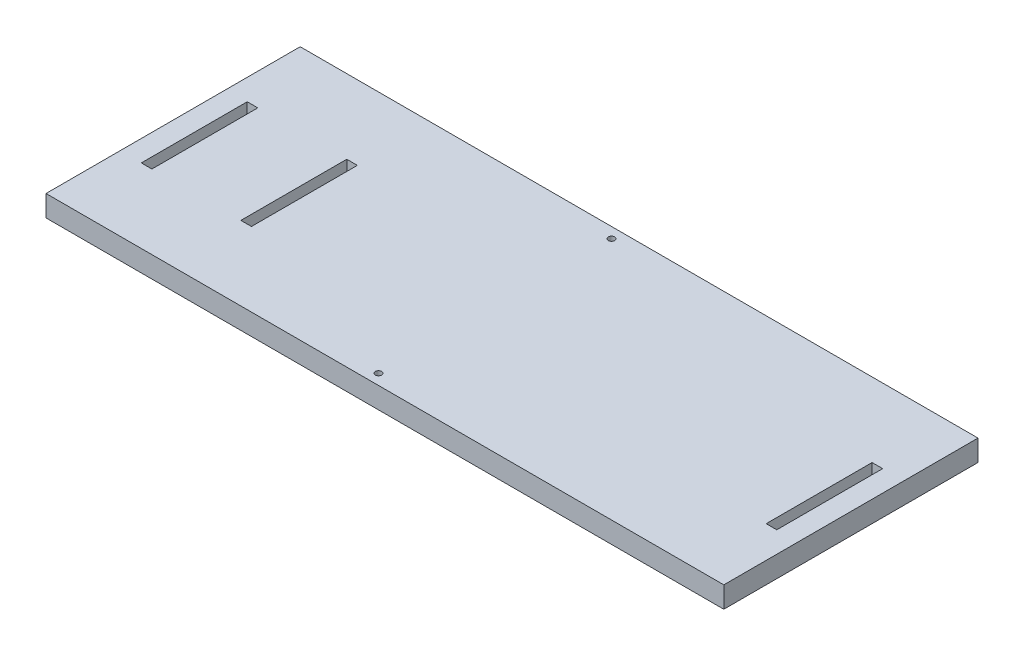
ISO-10303-21;
HEADER;
FILE_DESCRIPTION(('STEP AP214'),'2;1');
FILE_NAME('part.step','',(''),(''),'','','');
FILE_SCHEMA(('AUTOMOTIVE_DESIGN { 1 0 10303 214 1 1 1 1 }'));
ENDSEC;
DATA;
#1=APPLICATION_CONTEXT('core data for automotive mechanical design processes');
#2=APPLICATION_PROTOCOL_DEFINITION('international standard','automotive_design',2000,#1);
#3=PRODUCT_CONTEXT('',#1,'mechanical');
#4=PRODUCT('Part','Part','',(#3));
#5=PRODUCT_RELATED_PRODUCT_CATEGORY('part','',(#4));
#6=PRODUCT_DEFINITION_FORMATION('','',#4);
#7=PRODUCT_DEFINITION_CONTEXT('part definition',#1,'design');
#8=PRODUCT_DEFINITION('design','',#6,#7);
#9=PRODUCT_DEFINITION_SHAPE('','',#8);
#10=(LENGTH_UNIT() NAMED_UNIT(*) SI_UNIT(.MILLI.,.METRE.));
#11=(NAMED_UNIT(*) PLANE_ANGLE_UNIT() SI_UNIT($,.RADIAN.));
#12=(NAMED_UNIT(*) SI_UNIT($,.STERADIAN.) SOLID_ANGLE_UNIT());
#13=UNCERTAINTY_MEASURE_WITH_UNIT(LENGTH_MEASURE(1.E-05),#10,'distance_accuracy_value','');
#14=(GEOMETRIC_REPRESENTATION_CONTEXT(3) GLOBAL_UNCERTAINTY_ASSIGNED_CONTEXT((#13)) GLOBAL_UNIT_ASSIGNED_CONTEXT((#10,
#11,#12)) REPRESENTATION_CONTEXT('',''));
#15=CARTESIAN_POINT('',(0.,0.,0.));
#16=DIRECTION('',(0.,0.,1.));
#17=DIRECTION('',(1.,0.,0.));
#18=AXIS2_PLACEMENT_3D('',#15,#16,#17);
#19=CARTESIAN_POINT('',(0.,10.,0.));
#20=DIRECTION('',(0.,1.,0.));
#21=DIRECTION('',(0.,0.,1.));
#22=AXIS2_PLACEMENT_3D('',#19,#20,#21);
#23=PLANE('',#22);
#24=CARTESIAN_POINT('',(152.,10.,-15.));
#25=DIRECTION('',(0.,1.,0.));
#26=DIRECTION('',(0.,0.,1.));
#27=AXIS2_PLACEMENT_3D('',#24,#25,#26);
#28=CIRCLE('',#27,1.5);
#29=CARTESIAN_POINT('',(152.,10.,-13.5));
#30=VERTEX_POINT('',#29);
#31=EDGE_CURVE('E290',#30,#30,#28,.T.);
#32=ORIENTED_EDGE('',*,*,#31,.F.);
#33=EDGE_LOOP('',(#32));
#34=FACE_BOUND('',#33,.T.);
#35=CARTESIAN_POINT('',(152.,10.,95.));
#36=DIRECTION('',(0.,1.,0.));
#37=DIRECTION('',(0.,0.,-1.));
#38=AXIS2_PLACEMENT_3D('',#35,#36,#37);
#39=CIRCLE('',#38,1.5);
#40=CARTESIAN_POINT('',(152.,10.,93.5));
#41=VERTEX_POINT('',#40);
#42=EDGE_CURVE('E287',#41,#41,#39,.T.);
#43=ORIENTED_EDGE('',*,*,#42,.F.);
#44=EDGE_LOOP('',(#43));
#45=FACE_BOUND('',#44,.T.);
#46=DIRECTION('',(0.,0.,1.));
#47=VECTOR('',#46,1.);
#48=CARTESIAN_POINT('',(0.,10.,0.));
#49=LINE('',#48,#47);
#50=CARTESIAN_POINT('',(0.,10.,-20.));
#51=VERTEX_POINT('',#50);
#52=CARTESIAN_POINT('',(0.,10.,100.));
#53=VERTEX_POINT('',#52);
#54=EDGE_CURVE('E45',#51,#53,#49,.T.);
#55=ORIENTED_EDGE('',*,*,#54,.T.);
#56=DIRECTION('',(1.,0.,0.));
#57=VECTOR('',#56,1.);
#58=CARTESIAN_POINT('',(0.,10.,100.));
#59=LINE('',#58,#57);
#60=CARTESIAN_POINT('',(320.,10.,100.));
#61=VERTEX_POINT('',#60);
#62=EDGE_CURVE('E166',#53,#61,#59,.T.);
#63=ORIENTED_EDGE('',*,*,#62,.T.);
#64=DIRECTION('',(0.,0.,-1.));
#65=VECTOR('',#64,1.);
#66=CARTESIAN_POINT('',(320.,10.,0.));
#67=LINE('',#66,#65);
#68=CARTESIAN_POINT('',(320.,10.,-20.));
#69=VERTEX_POINT('',#68);
#70=EDGE_CURVE('E11',#61,#69,#67,.T.);
#71=ORIENTED_EDGE('',*,*,#70,.T.);
#72=DIRECTION('',(-1.,0.,0.));
#73=VECTOR('',#72,1.);
#74=CARTESIAN_POINT('',(0.,10.,-20.));
#75=LINE('',#74,#73);
#76=EDGE_CURVE('E174',#69,#51,#75,.T.);
#77=ORIENTED_EDGE('',*,*,#76,.T.);
#78=EDGE_LOOP('',(#55,#63,#71,#77));
#79=FACE_BOUND('',#78,.T.);
#80=DIRECTION('',(1.,0.,0.));
#81=VECTOR('',#80,1.);
#82=CARTESIAN_POINT('',(10.,10.,65.));
#83=LINE('',#82,#81);
#84=CARTESIAN_POINT('',(10.,10.,65.));
#85=VERTEX_POINT('',#84);
#86=CARTESIAN_POINT('',(15.,10.,65.));
#87=VERTEX_POINT('',#86);
#88=EDGE_CURVE('E246',#85,#87,#83,.T.);
#89=ORIENTED_EDGE('',*,*,#88,.F.);
#90=DIRECTION('',(0.,0.,1.));
#91=VECTOR('',#90,1.);
#92=CARTESIAN_POINT('',(9.99999999999999,10.,15.));
#93=LINE('',#92,#91);
#94=CARTESIAN_POINT('',(9.99999999999999,10.,15.));
#95=VERTEX_POINT('',#94);
#96=EDGE_CURVE('E244',#95,#85,#93,.T.);
#97=ORIENTED_EDGE('',*,*,#96,.F.);
#98=DIRECTION('',(-1.,0.,0.));
#99=VECTOR('',#98,1.);
#100=CARTESIAN_POINT('',(9.99999999999999,10.,15.));
#101=LINE('',#100,#99);
#102=CARTESIAN_POINT('',(15.,10.,15.));
#103=VERTEX_POINT('',#102);
#104=EDGE_CURVE('E252',#103,#95,#101,.T.);
#105=ORIENTED_EDGE('',*,*,#104,.F.);
#106=DIRECTION('',(0.,0.,-1.));
#107=VECTOR('',#106,1.);
#108=CARTESIAN_POINT('',(15.,10.,15.));
#109=LINE('',#108,#107);
#110=EDGE_CURVE('E249',#87,#103,#109,.T.);
#111=ORIENTED_EDGE('',*,*,#110,.F.);
#112=EDGE_LOOP('',(#89,#97,#105,#111));
#113=FACE_BOUND('',#112,.T.);
#114=DIRECTION('',(1.,0.,0.));
#115=VECTOR('',#114,1.);
#116=CARTESIAN_POINT('',(57.,10.,65.));
#117=LINE('',#116,#115);
#118=CARTESIAN_POINT('',(57.,10.,65.));
#119=VERTEX_POINT('',#118);
#120=CARTESIAN_POINT('',(62.,10.,65.));
#121=VERTEX_POINT('',#120);
#122=EDGE_CURVE('E215',#119,#121,#117,.T.);
#123=ORIENTED_EDGE('',*,*,#122,.F.);
#124=DIRECTION('',(0.,0.,1.));
#125=VECTOR('',#124,1.);
#126=CARTESIAN_POINT('',(57.,10.,15.));
#127=LINE('',#126,#125);
#128=CARTESIAN_POINT('',(57.,10.,15.));
#129=VERTEX_POINT('',#128);
#130=EDGE_CURVE('E213',#129,#119,#127,.T.);
#131=ORIENTED_EDGE('',*,*,#130,.F.);
#132=DIRECTION('',(-1.,0.,0.));
#133=VECTOR('',#132,1.);
#134=CARTESIAN_POINT('',(57.,10.,15.));
#135=LINE('',#134,#133);
#136=CARTESIAN_POINT('',(62.,10.,15.));
#137=VERTEX_POINT('',#136);
#138=EDGE_CURVE('E221',#137,#129,#135,.T.);
#139=ORIENTED_EDGE('',*,*,#138,.F.);
#140=DIRECTION('',(0.,0.,-1.));
#141=VECTOR('',#140,1.);
#142=CARTESIAN_POINT('',(62.,10.,15.));
#143=LINE('',#142,#141);
#144=EDGE_CURVE('E218',#121,#137,#143,.T.);
#145=ORIENTED_EDGE('',*,*,#144,.F.);
#146=EDGE_LOOP('',(#123,#131,#139,#145));
#147=FACE_BOUND('',#146,.T.);
#148=DIRECTION('',(1.,0.,0.));
#149=VECTOR('',#148,1.);
#150=CARTESIAN_POINT('',(305.,10.,65.));
#151=LINE('',#150,#149);
#152=CARTESIAN_POINT('',(305.,10.,65.));
#153=VERTEX_POINT('',#152);
#154=CARTESIAN_POINT('',(310.,10.,65.));
#155=VERTEX_POINT('',#154);
#156=EDGE_CURVE('E189',#153,#155,#151,.T.);
#157=ORIENTED_EDGE('',*,*,#156,.F.);
#158=DIRECTION('',(0.,0.,1.));
#159=VECTOR('',#158,1.);
#160=CARTESIAN_POINT('',(305.,10.,15.));
#161=LINE('',#160,#159);
#162=CARTESIAN_POINT('',(305.,10.,15.));
#163=VERTEX_POINT('',#162);
#164=EDGE_CURVE('E187',#163,#153,#161,.T.);
#165=ORIENTED_EDGE('',*,*,#164,.F.);
#166=DIRECTION('',(-1.,0.,0.));
#167=VECTOR('',#166,1.);
#168=CARTESIAN_POINT('',(305.,10.,15.));
#169=LINE('',#168,#167);
#170=CARTESIAN_POINT('',(310.,10.,15.));
#171=VERTEX_POINT('',#170);
#172=EDGE_CURVE('E194',#171,#163,#169,.T.);
#173=ORIENTED_EDGE('',*,*,#172,.F.);
#174=DIRECTION('',(0.,0.,-1.));
#175=VECTOR('',#174,1.);
#176=CARTESIAN_POINT('',(310.,10.,15.));
#177=LINE('',#176,#175);
#178=EDGE_CURVE('E192',#155,#171,#177,.T.);
#179=ORIENTED_EDGE('',*,*,#178,.F.);
#180=EDGE_LOOP('',(#157,#165,#173,#179));
#181=FACE_BOUND('',#180,.T.);
#182=ADVANCED_FACE('F36',(#34,#45,#79,#113,#147,#181),#23,.T.);
#183=CARTESIAN_POINT('',(0.,0.,0.));
#184=DIRECTION('',(0.,1.,0.));
#185=DIRECTION('',(0.,0.,1.));
#186=AXIS2_PLACEMENT_3D('',#183,#184,#185);
#187=PLANE('',#186);
#188=CARTESIAN_POINT('',(152.,0.,-15.));
#189=DIRECTION('',(0.,1.,0.));
#190=DIRECTION('',(0.,0.,1.));
#191=AXIS2_PLACEMENT_3D('',#188,#189,#190);
#192=CIRCLE('',#191,1.5);
#193=CARTESIAN_POINT('',(152.,0.,-13.5));
#194=VERTEX_POINT('',#193);
#195=EDGE_CURVE('E170',#194,#194,#192,.T.);
#196=ORIENTED_EDGE('',*,*,#195,.T.);
#197=EDGE_LOOP('',(#196));
#198=FACE_BOUND('',#197,.T.);
#199=CARTESIAN_POINT('',(152.,0.,95.));
#200=DIRECTION('',(0.,1.,0.));
#201=DIRECTION('',(0.,0.,-1.));
#202=AXIS2_PLACEMENT_3D('',#199,#200,#201);
#203=CIRCLE('',#202,1.5);
#204=CARTESIAN_POINT('',(152.,0.,93.5));
#205=VERTEX_POINT('',#204);
#206=EDGE_CURVE('E284',#205,#205,#203,.T.);
#207=ORIENTED_EDGE('',*,*,#206,.T.);
#208=EDGE_LOOP('',(#207));
#209=FACE_BOUND('',#208,.T.);
#210=DIRECTION('',(0.,0.,1.));
#211=VECTOR('',#210,1.);
#212=CARTESIAN_POINT('',(57.,0.,15.));
#213=LINE('',#212,#211);
#214=CARTESIAN_POINT('',(57.,0.,15.));
#215=VERTEX_POINT('',#214);
#216=CARTESIAN_POINT('',(57.,0.,65.));
#217=VERTEX_POINT('',#216);
#218=EDGE_CURVE('E212',#215,#217,#213,.T.);
#219=ORIENTED_EDGE('',*,*,#218,.T.);
#220=DIRECTION('',(1.,0.,0.));
#221=VECTOR('',#220,1.);
#222=CARTESIAN_POINT('',(57.,0.,65.));
#223=LINE('',#222,#221);
#224=CARTESIAN_POINT('',(62.,0.,65.));
#225=VERTEX_POINT('',#224);
#226=EDGE_CURVE('E226',#217,#225,#223,.T.);
#227=ORIENTED_EDGE('',*,*,#226,.T.);
#228=DIRECTION('',(0.,0.,-1.));
#229=VECTOR('',#228,1.);
#230=CARTESIAN_POINT('',(62.,0.,15.));
#231=LINE('',#230,#229);
#232=CARTESIAN_POINT('',(62.,0.,15.));
#233=VERTEX_POINT('',#232);
#234=EDGE_CURVE('E229',#225,#233,#231,.T.);
#235=ORIENTED_EDGE('',*,*,#234,.T.);
#236=DIRECTION('',(-1.,0.,0.));
#237=VECTOR('',#236,1.);
#238=CARTESIAN_POINT('',(57.,0.,15.));
#239=LINE('',#238,#237);
#240=EDGE_CURVE('E216',#233,#215,#239,.T.);
#241=ORIENTED_EDGE('',*,*,#240,.T.);
#242=EDGE_LOOP('',(#219,#227,#235,#241));
#243=FACE_BOUND('',#242,.T.);
#244=DIRECTION('',(0.,0.,1.));
#245=VECTOR('',#244,1.);
#246=CARTESIAN_POINT('',(0.,0.,0.));
#247=LINE('',#246,#245);
#248=CARTESIAN_POINT('',(0.,0.,-20.));
#249=VERTEX_POINT('',#248);
#250=CARTESIAN_POINT('',(0.,0.,100.));
#251=VERTEX_POINT('',#250);
#252=EDGE_CURVE('E274',#249,#251,#247,.T.);
#253=ORIENTED_EDGE('',*,*,#252,.F.);
#254=DIRECTION('',(-1.,0.,0.));
#255=VECTOR('',#254,1.);
#256=CARTESIAN_POINT('',(0.,0.,-20.));
#257=LINE('',#256,#255);
#258=CARTESIAN_POINT('',(320.,0.,-20.));
#259=VERTEX_POINT('',#258);
#260=EDGE_CURVE('E176',#259,#249,#257,.T.);
#261=ORIENTED_EDGE('',*,*,#260,.F.);
#262=DIRECTION('',(0.,0.,-1.));
#263=VECTOR('',#262,1.);
#264=CARTESIAN_POINT('',(320.,0.,0.));
#265=LINE('',#264,#263);
#266=CARTESIAN_POINT('',(320.,0.,100.));
#267=VERTEX_POINT('',#266);
#268=EDGE_CURVE('E40',#267,#259,#265,.T.);
#269=ORIENTED_EDGE('',*,*,#268,.F.);
#270=DIRECTION('',(1.,0.,0.));
#271=VECTOR('',#270,1.);
#272=CARTESIAN_POINT('',(0.,0.,100.));
#273=LINE('',#272,#271);
#274=EDGE_CURVE('E168',#251,#267,#273,.T.);
#275=ORIENTED_EDGE('',*,*,#274,.F.);
#276=EDGE_LOOP('',(#253,#261,#269,#275));
#277=FACE_BOUND('',#276,.T.);
#278=DIRECTION('',(0.,0.,1.));
#279=VECTOR('',#278,1.);
#280=CARTESIAN_POINT('',(9.99999999999999,0.,15.));
#281=LINE('',#280,#279);
#282=CARTESIAN_POINT('',(9.99999999999999,0.,15.));
#283=VERTEX_POINT('',#282);
#284=CARTESIAN_POINT('',(10.,0.,65.));
#285=VERTEX_POINT('',#284);
#286=EDGE_CURVE('E243',#283,#285,#281,.T.);
#287=ORIENTED_EDGE('',*,*,#286,.T.);
#288=DIRECTION('',(1.,0.,0.));
#289=VECTOR('',#288,1.);
#290=CARTESIAN_POINT('',(10.,0.,65.));
#291=LINE('',#290,#289);
#292=CARTESIAN_POINT('',(15.,0.,65.));
#293=VERTEX_POINT('',#292);
#294=EDGE_CURVE('E257',#285,#293,#291,.T.);
#295=ORIENTED_EDGE('',*,*,#294,.T.);
#296=DIRECTION('',(0.,0.,-1.));
#297=VECTOR('',#296,1.);
#298=CARTESIAN_POINT('',(15.,0.,15.));
#299=LINE('',#298,#297);
#300=CARTESIAN_POINT('',(15.,0.,15.));
#301=VERTEX_POINT('',#300);
#302=EDGE_CURVE('E260',#293,#301,#299,.T.);
#303=ORIENTED_EDGE('',*,*,#302,.T.);
#304=DIRECTION('',(-1.,0.,0.));
#305=VECTOR('',#304,1.);
#306=CARTESIAN_POINT('',(9.99999999999999,0.,15.));
#307=LINE('',#306,#305);
#308=EDGE_CURVE('E247',#301,#283,#307,.T.);
#309=ORIENTED_EDGE('',*,*,#308,.T.);
#310=EDGE_LOOP('',(#287,#295,#303,#309));
#311=FACE_BOUND('',#310,.T.);
#312=DIRECTION('',(0.,0.,1.));
#313=VECTOR('',#312,1.);
#314=CARTESIAN_POINT('',(305.,0.,15.));
#315=LINE('',#314,#313);
#316=CARTESIAN_POINT('',(305.,0.,15.));
#317=VERTEX_POINT('',#316);
#318=CARTESIAN_POINT('',(305.,0.,65.));
#319=VERTEX_POINT('',#318);
#320=EDGE_CURVE('E61',#317,#319,#315,.T.);
#321=ORIENTED_EDGE('',*,*,#320,.T.);
#322=DIRECTION('',(1.,0.,0.));
#323=VECTOR('',#322,1.);
#324=CARTESIAN_POINT('',(305.,0.,65.));
#325=LINE('',#324,#323);
#326=CARTESIAN_POINT('',(310.,0.,65.));
#327=VERTEX_POINT('',#326);
#328=EDGE_CURVE('E198',#319,#327,#325,.T.);
#329=ORIENTED_EDGE('',*,*,#328,.T.);
#330=DIRECTION('',(0.,0.,-1.));
#331=VECTOR('',#330,1.);
#332=CARTESIAN_POINT('',(310.,0.,15.));
#333=LINE('',#332,#331);
#334=CARTESIAN_POINT('',(310.,0.,15.));
#335=VERTEX_POINT('',#334);
#336=EDGE_CURVE('E201',#327,#335,#333,.T.);
#337=ORIENTED_EDGE('',*,*,#336,.T.);
#338=DIRECTION('',(-1.,0.,0.));
#339=VECTOR('',#338,1.);
#340=CARTESIAN_POINT('',(305.,0.,15.));
#341=LINE('',#340,#339);
#342=EDGE_CURVE('E190',#335,#317,#341,.T.);
#343=ORIENTED_EDGE('',*,*,#342,.T.);
#344=EDGE_LOOP('',(#321,#329,#337,#343));
#345=FACE_BOUND('',#344,.T.);
#346=ADVANCED_FACE('F281',(#198,#209,#243,#277,#311,#345),#187,.F.);
#347=CARTESIAN_POINT('',(0.,10.,0.));
#348=DIRECTION('',(1.,0.,0.));
#349=DIRECTION('',(0.,0.,-1.));
#350=AXIS2_PLACEMENT_3D('',#347,#348,#349);
#351=PLANE('',#350);
#352=ORIENTED_EDGE('',*,*,#252,.T.);
#353=DIRECTION('',(0.,1.,0.));
#354=VECTOR('',#353,1.);
#355=CARTESIAN_POINT('',(0.,0.,100.));
#356=LINE('',#355,#354);
#357=EDGE_CURVE('E169',#251,#53,#356,.T.);
#358=ORIENTED_EDGE('',*,*,#357,.T.);
#359=ORIENTED_EDGE('',*,*,#54,.F.);
#360=DIRECTION('',(0.,1.,0.));
#361=VECTOR('',#360,1.);
#362=CARTESIAN_POINT('',(0.,0.,-20.));
#363=LINE('',#362,#361);
#364=EDGE_CURVE('E183',#249,#51,#363,.T.);
#365=ORIENTED_EDGE('',*,*,#364,.F.);
#366=EDGE_LOOP('',(#352,#358,#359,#365));
#367=FACE_BOUND('',#366,.T.);
#368=ADVANCED_FACE('F38',(#367),#351,.F.);
#369=CARTESIAN_POINT('',(320.,10.,0.));
#370=DIRECTION('',(-1.,0.,0.));
#371=DIRECTION('',(0.,0.,1.));
#372=AXIS2_PLACEMENT_3D('',#369,#370,#371);
#373=PLANE('',#372);
#374=ORIENTED_EDGE('',*,*,#268,.T.);
#375=DIRECTION('',(0.,1.,0.));
#376=VECTOR('',#375,1.);
#377=CARTESIAN_POINT('',(320.,0.,-20.));
#378=LINE('',#377,#376);
#379=EDGE_CURVE('E157',#259,#69,#378,.T.);
#380=ORIENTED_EDGE('',*,*,#379,.T.);
#381=ORIENTED_EDGE('',*,*,#70,.F.);
#382=DIRECTION('',(0.,1.,0.));
#383=VECTOR('',#382,1.);
#384=CARTESIAN_POINT('',(320.,0.,100.));
#385=LINE('',#384,#383);
#386=EDGE_CURVE('E154',#267,#61,#385,.T.);
#387=ORIENTED_EDGE('',*,*,#386,.F.);
#388=EDGE_LOOP('',(#374,#380,#381,#387));
#389=FACE_BOUND('',#388,.T.);
#390=ADVANCED_FACE('F153',(#389),#373,.F.);
#391=CARTESIAN_POINT('',(9.99999999999999,10.,15.));
#392=DIRECTION('',(1.,0.,0.));
#393=DIRECTION('',(0.,0.,-1.));
#394=AXIS2_PLACEMENT_3D('',#391,#392,#393);
#395=PLANE('',#394);
#396=ORIENTED_EDGE('',*,*,#286,.F.);
#397=DIRECTION('',(0.,-1.,0.));
#398=VECTOR('',#397,1.);
#399=CARTESIAN_POINT('',(9.99999999999999,10.,15.));
#400=LINE('',#399,#398);
#401=EDGE_CURVE('E254',#95,#283,#400,.T.);
#402=ORIENTED_EDGE('',*,*,#401,.F.);
#403=ORIENTED_EDGE('',*,*,#96,.T.);
#404=DIRECTION('',(0.,-1.,0.));
#405=VECTOR('',#404,1.);
#406=CARTESIAN_POINT('',(10.,10.,65.));
#407=LINE('',#406,#405);
#408=EDGE_CURVE('E271',#85,#285,#407,.T.);
#409=ORIENTED_EDGE('',*,*,#408,.T.);
#410=EDGE_LOOP('',(#396,#402,#403,#409));
#411=FACE_BOUND('',#410,.T.);
#412=ADVANCED_FACE('F362',(#411),#395,.T.);
#413=CARTESIAN_POINT('',(10.,10.,65.));
#414=DIRECTION('',(0.,0.,-1.));
#415=DIRECTION('',(-1.,0.,0.));
#416=AXIS2_PLACEMENT_3D('',#413,#414,#415);
#417=PLANE('',#416);
#418=ORIENTED_EDGE('',*,*,#294,.F.);
#419=ORIENTED_EDGE('',*,*,#408,.F.);
#420=ORIENTED_EDGE('',*,*,#88,.T.);
#421=DIRECTION('',(0.,-1.,0.));
#422=VECTOR('',#421,1.);
#423=CARTESIAN_POINT('',(15.,10.,65.));
#424=LINE('',#423,#422);
#425=EDGE_CURVE('E269',#87,#293,#424,.T.);
#426=ORIENTED_EDGE('',*,*,#425,.T.);
#427=EDGE_LOOP('',(#418,#419,#420,#426));
#428=FACE_BOUND('',#427,.T.);
#429=ADVANCED_FACE('F358',(#428),#417,.T.);
#430=CARTESIAN_POINT('',(15.,10.,15.));
#431=DIRECTION('',(-1.,0.,0.));
#432=DIRECTION('',(0.,0.,1.));
#433=AXIS2_PLACEMENT_3D('',#430,#431,#432);
#434=PLANE('',#433);
#435=ORIENTED_EDGE('',*,*,#302,.F.);
#436=ORIENTED_EDGE('',*,*,#425,.F.);
#437=ORIENTED_EDGE('',*,*,#110,.T.);
#438=DIRECTION('',(0.,-1.,0.));
#439=VECTOR('',#438,1.);
#440=CARTESIAN_POINT('',(15.,10.,15.));
#441=LINE('',#440,#439);
#442=EDGE_CURVE('E267',#103,#301,#441,.T.);
#443=ORIENTED_EDGE('',*,*,#442,.T.);
#444=EDGE_LOOP('',(#435,#436,#437,#443));
#445=FACE_BOUND('',#444,.T.);
#446=ADVANCED_FACE('F354',(#445),#434,.T.);
#447=CARTESIAN_POINT('',(9.99999999999999,10.,15.));
#448=DIRECTION('',(0.,0.,1.));
#449=DIRECTION('',(1.,0.,0.));
#450=AXIS2_PLACEMENT_3D('',#447,#448,#449);
#451=PLANE('',#450);
#452=ORIENTED_EDGE('',*,*,#308,.F.);
#453=ORIENTED_EDGE('',*,*,#442,.F.);
#454=ORIENTED_EDGE('',*,*,#104,.T.);
#455=ORIENTED_EDGE('',*,*,#401,.T.);
#456=EDGE_LOOP('',(#452,#453,#454,#455));
#457=FACE_BOUND('',#456,.T.);
#458=ADVANCED_FACE('F350',(#457),#451,.T.);
#459=CARTESIAN_POINT('',(57.,10.,15.));
#460=DIRECTION('',(1.,0.,0.));
#461=DIRECTION('',(0.,0.,-1.));
#462=AXIS2_PLACEMENT_3D('',#459,#460,#461);
#463=PLANE('',#462);
#464=ORIENTED_EDGE('',*,*,#218,.F.);
#465=DIRECTION('',(0.,-1.,0.));
#466=VECTOR('',#465,1.);
#467=CARTESIAN_POINT('',(57.,10.,15.));
#468=LINE('',#467,#466);
#469=EDGE_CURVE('E223',#129,#215,#468,.T.);
#470=ORIENTED_EDGE('',*,*,#469,.F.);
#471=ORIENTED_EDGE('',*,*,#130,.T.);
#472=DIRECTION('',(0.,-1.,0.));
#473=VECTOR('',#472,1.);
#474=CARTESIAN_POINT('',(57.,10.,65.));
#475=LINE('',#474,#473);
#476=EDGE_CURVE('E240',#119,#217,#475,.T.);
#477=ORIENTED_EDGE('',*,*,#476,.T.);
#478=EDGE_LOOP('',(#464,#470,#471,#477));
#479=FACE_BOUND('',#478,.T.);
#480=ADVANCED_FACE('F346',(#479),#463,.T.);
#481=CARTESIAN_POINT('',(57.,10.,65.));
#482=DIRECTION('',(0.,0.,-1.));
#483=DIRECTION('',(-1.,0.,0.));
#484=AXIS2_PLACEMENT_3D('',#481,#482,#483);
#485=PLANE('',#484);
#486=ORIENTED_EDGE('',*,*,#226,.F.);
#487=ORIENTED_EDGE('',*,*,#476,.F.);
#488=ORIENTED_EDGE('',*,*,#122,.T.);
#489=DIRECTION('',(0.,-1.,0.));
#490=VECTOR('',#489,1.);
#491=CARTESIAN_POINT('',(62.,10.,65.));
#492=LINE('',#491,#490);
#493=EDGE_CURVE('E238',#121,#225,#492,.T.);
#494=ORIENTED_EDGE('',*,*,#493,.T.);
#495=EDGE_LOOP('',(#486,#487,#488,#494));
#496=FACE_BOUND('',#495,.T.);
#497=ADVANCED_FACE('F342',(#496),#485,.T.);
#498=CARTESIAN_POINT('',(62.,10.,15.));
#499=DIRECTION('',(-1.,0.,0.));
#500=DIRECTION('',(0.,0.,1.));
#501=AXIS2_PLACEMENT_3D('',#498,#499,#500);
#502=PLANE('',#501);
#503=ORIENTED_EDGE('',*,*,#234,.F.);
#504=ORIENTED_EDGE('',*,*,#493,.F.);
#505=ORIENTED_EDGE('',*,*,#144,.T.);
#506=DIRECTION('',(0.,-1.,0.));
#507=VECTOR('',#506,1.);
#508=CARTESIAN_POINT('',(62.,10.,15.));
#509=LINE('',#508,#507);
#510=EDGE_CURVE('E236',#137,#233,#509,.T.);
#511=ORIENTED_EDGE('',*,*,#510,.T.);
#512=EDGE_LOOP('',(#503,#504,#505,#511));
#513=FACE_BOUND('',#512,.T.);
#514=ADVANCED_FACE('F338',(#513),#502,.T.);
#515=CARTESIAN_POINT('',(57.,10.,15.));
#516=DIRECTION('',(0.,0.,1.));
#517=DIRECTION('',(1.,0.,0.));
#518=AXIS2_PLACEMENT_3D('',#515,#516,#517);
#519=PLANE('',#518);
#520=ORIENTED_EDGE('',*,*,#240,.F.);
#521=ORIENTED_EDGE('',*,*,#510,.F.);
#522=ORIENTED_EDGE('',*,*,#138,.T.);
#523=ORIENTED_EDGE('',*,*,#469,.T.);
#524=EDGE_LOOP('',(#520,#521,#522,#523));
#525=FACE_BOUND('',#524,.T.);
#526=ADVANCED_FACE('F335',(#525),#519,.T.);
#527=CARTESIAN_POINT('',(305.,10.,15.));
#528=DIRECTION('',(1.,0.,0.));
#529=DIRECTION('',(0.,0.,-1.));
#530=AXIS2_PLACEMENT_3D('',#527,#528,#529);
#531=PLANE('',#530);
#532=ORIENTED_EDGE('',*,*,#320,.F.);
#533=DIRECTION('',(0.,-1.,0.));
#534=VECTOR('',#533,1.);
#535=CARTESIAN_POINT('',(305.,10.,15.));
#536=LINE('',#535,#534);
#537=EDGE_CURVE('E196',#163,#317,#536,.T.);
#538=ORIENTED_EDGE('',*,*,#537,.F.);
#539=ORIENTED_EDGE('',*,*,#164,.T.);
#540=DIRECTION('',(0.,-1.,0.));
#541=VECTOR('',#540,1.);
#542=CARTESIAN_POINT('',(305.,10.,65.));
#543=LINE('',#542,#541);
#544=EDGE_CURVE('E210',#153,#319,#543,.T.);
#545=ORIENTED_EDGE('',*,*,#544,.T.);
#546=EDGE_LOOP('',(#532,#538,#539,#545));
#547=FACE_BOUND('',#546,.T.);
#548=ADVANCED_FACE('F331',(#547),#531,.T.);
#549=CARTESIAN_POINT('',(305.,10.,65.));
#550=DIRECTION('',(0.,0.,-1.));
#551=DIRECTION('',(-1.,0.,0.));
#552=AXIS2_PLACEMENT_3D('',#549,#550,#551);
#553=PLANE('',#552);
#554=ORIENTED_EDGE('',*,*,#328,.F.);
#555=ORIENTED_EDGE('',*,*,#544,.F.);
#556=ORIENTED_EDGE('',*,*,#156,.T.);
#557=DIRECTION('',(0.,-1.,0.));
#558=VECTOR('',#557,1.);
#559=CARTESIAN_POINT('',(310.,10.,65.));
#560=LINE('',#559,#558);
#561=EDGE_CURVE('E208',#155,#327,#560,.T.);
#562=ORIENTED_EDGE('',*,*,#561,.T.);
#563=EDGE_LOOP('',(#554,#555,#556,#562));
#564=FACE_BOUND('',#563,.T.);
#565=ADVANCED_FACE('F327',(#564),#553,.T.);
#566=CARTESIAN_POINT('',(310.,10.,15.));
#567=DIRECTION('',(-1.,0.,0.));
#568=DIRECTION('',(0.,0.,1.));
#569=AXIS2_PLACEMENT_3D('',#566,#567,#568);
#570=PLANE('',#569);
#571=ORIENTED_EDGE('',*,*,#336,.F.);
#572=ORIENTED_EDGE('',*,*,#561,.F.);
#573=ORIENTED_EDGE('',*,*,#178,.T.);
#574=DIRECTION('',(0.,-1.,0.));
#575=VECTOR('',#574,1.);
#576=CARTESIAN_POINT('',(310.,10.,15.));
#577=LINE('',#576,#575);
#578=EDGE_CURVE('E53',#171,#335,#577,.T.);
#579=ORIENTED_EDGE('',*,*,#578,.T.);
#580=EDGE_LOOP('',(#571,#572,#573,#579));
#581=FACE_BOUND('',#580,.T.);
#582=ADVANCED_FACE('F324',(#581),#570,.T.);
#583=CARTESIAN_POINT('',(305.,10.,15.));
#584=DIRECTION('',(0.,0.,1.));
#585=DIRECTION('',(1.,0.,0.));
#586=AXIS2_PLACEMENT_3D('',#583,#584,#585);
#587=PLANE('',#586);
#588=ORIENTED_EDGE('',*,*,#342,.F.);
#589=ORIENTED_EDGE('',*,*,#578,.F.);
#590=ORIENTED_EDGE('',*,*,#172,.T.);
#591=ORIENTED_EDGE('',*,*,#537,.T.);
#592=EDGE_LOOP('',(#588,#589,#590,#591));
#593=FACE_BOUND('',#592,.T.);
#594=ADVANCED_FACE('F321',(#593),#587,.T.);
#595=CARTESIAN_POINT('',(0.,0.,-20.));
#596=DIRECTION('',(0.,0.,-1.));
#597=DIRECTION('',(-1.,0.,0.));
#598=AXIS2_PLACEMENT_3D('',#595,#596,#597);
#599=PLANE('',#598);
#600=ORIENTED_EDGE('',*,*,#76,.F.);
#601=ORIENTED_EDGE('',*,*,#379,.F.);
#602=ORIENTED_EDGE('',*,*,#260,.T.);
#603=ORIENTED_EDGE('',*,*,#364,.T.);
#604=EDGE_LOOP('',(#600,#601,#602,#603));
#605=FACE_BOUND('',#604,.T.);
#606=ADVANCED_FACE('F280',(#605),#599,.T.);
#607=CARTESIAN_POINT('',(0.,0.,100.));
#608=DIRECTION('',(0.,0.,1.));
#609=DIRECTION('',(1.,0.,0.));
#610=AXIS2_PLACEMENT_3D('',#607,#608,#609);
#611=PLANE('',#610);
#612=ORIENTED_EDGE('',*,*,#62,.F.);
#613=ORIENTED_EDGE('',*,*,#357,.F.);
#614=ORIENTED_EDGE('',*,*,#274,.T.);
#615=ORIENTED_EDGE('',*,*,#386,.T.);
#616=EDGE_LOOP('',(#612,#613,#614,#615));
#617=FACE_BOUND('',#616,.T.);
#618=ADVANCED_FACE('F164',(#617),#611,.T.);
#619=CARTESIAN_POINT('',(152.,0.,95.));
#620=DIRECTION('',(0.,1.,0.));
#621=DIRECTION('',(0.,0.,1.));
#622=AXIS2_PLACEMENT_3D('',#619,#620,#621);
#623=CYLINDRICAL_SURFACE('',#622,1.5);
#624=ORIENTED_EDGE('',*,*,#206,.F.);
#625=EDGE_LOOP('',(#624));
#626=FACE_BOUND('',#625,.T.);
#627=ORIENTED_EDGE('',*,*,#42,.T.);
#628=EDGE_LOOP('',(#627));
#629=FACE_BOUND('',#628,.T.);
#630=ADVANCED_FACE('F301',(#626,#629),#623,.F.);
#631=CARTESIAN_POINT('',(152.,0.,-15.));
#632=DIRECTION('',(0.,1.,0.));
#633=DIRECTION('',(0.,0.,1.));
#634=AXIS2_PLACEMENT_3D('',#631,#632,#633);
#635=CYLINDRICAL_SURFACE('',#634,1.5);
#636=ORIENTED_EDGE('',*,*,#195,.F.);
#637=EDGE_LOOP('',(#636));
#638=FACE_BOUND('',#637,.T.);
#639=ORIENTED_EDGE('',*,*,#31,.T.);
#640=EDGE_LOOP('',(#639));
#641=FACE_BOUND('',#640,.T.);
#642=ADVANCED_FACE('F298',(#638,#641),#635,.F.);
#643=CLOSED_SHELL('',(#182,#346,#368,#390,#412,#429,#446,#458,#480,#497,#514,#526,#548,#565,
#582,#594,#606,#618,#630,#642));
#644=MANIFOLD_SOLID_BREP('B2',#643);
#645=ADVANCED_BREP_SHAPE_REPRESENTATION('',(#18,#644),#14);
#646=SHAPE_DEFINITION_REPRESENTATION(#9,#645);
ENDSEC;
END-ISO-10303-21;
